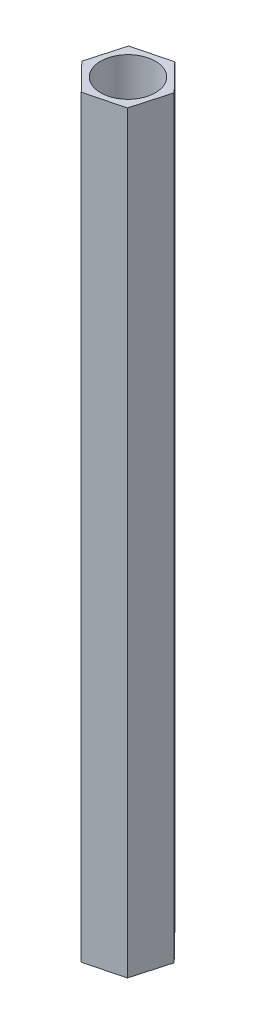
ISO-10303-21;
HEADER;
FILE_DESCRIPTION(('STEP AP214'),'2;1');
FILE_NAME('part.step','',(''),(''),'','','');
FILE_SCHEMA(('AUTOMOTIVE_DESIGN { 1 0 10303 214 1 1 1 1 }'));
ENDSEC;
DATA;
#1=APPLICATION_CONTEXT('core data for automotive mechanical design processes');
#2=APPLICATION_PROTOCOL_DEFINITION('international standard','automotive_design',2000,#1);
#3=PRODUCT_CONTEXT('',#1,'mechanical');
#4=PRODUCT('Part','Part','',(#3));
#5=PRODUCT_RELATED_PRODUCT_CATEGORY('part','',(#4));
#6=PRODUCT_DEFINITION_FORMATION('','',#4);
#7=PRODUCT_DEFINITION_CONTEXT('part definition',#1,'design');
#8=PRODUCT_DEFINITION('design','',#6,#7);
#9=PRODUCT_DEFINITION_SHAPE('','',#8);
#10=(LENGTH_UNIT() NAMED_UNIT(*) SI_UNIT(.MILLI.,.METRE.));
#11=(NAMED_UNIT(*) PLANE_ANGLE_UNIT() SI_UNIT($,.RADIAN.));
#12=(NAMED_UNIT(*) SI_UNIT($,.STERADIAN.) SOLID_ANGLE_UNIT());
#13=UNCERTAINTY_MEASURE_WITH_UNIT(LENGTH_MEASURE(1.E-05),#10,'distance_accuracy_value','');
#14=(GEOMETRIC_REPRESENTATION_CONTEXT(3) GLOBAL_UNCERTAINTY_ASSIGNED_CONTEXT((#13)) GLOBAL_UNIT_ASSIGNED_CONTEXT((#10,
#11,#12)) REPRESENTATION_CONTEXT('',''));
#15=CARTESIAN_POINT('',(0.,0.,0.));
#16=DIRECTION('',(0.,0.,1.));
#17=DIRECTION('',(1.,0.,0.));
#18=AXIS2_PLACEMENT_3D('',#15,#16,#17);
#19=CARTESIAN_POINT('',(-0.466108552747367,34.39,1.66815551345064));
#20=DIRECTION('',(-0.248500740996758,0.,-0.968631705925458));
#21=DIRECTION('',(-0.968631705925458,0.,0.248500740996758));
#22=AXIS2_PLACEMENT_3D('',#19,#20,#21);
#23=PLANE('',#22);
#24=DIRECTION('',(0.968631705925458,0.,-0.248500740996758));
#25=VECTOR('',#24,1.);
#26=CARTESIAN_POINT('',(-0.466108552747367,0.,1.66815551345064));
#27=LINE('',#26,#25);
#28=CARTESIAN_POINT('',(-0.466108552747367,0.,1.66815551345064));
#29=VERTEX_POINT('',#28);
#30=CARTESIAN_POINT('',(1.21161077573764,0.,1.23773960432574));
#31=VERTEX_POINT('',#30);
#32=EDGE_CURVE('E119',#29,#31,#27,.T.);
#33=ORIENTED_EDGE('',*,*,#32,.T.);
#34=DIRECTION('',(0.,-1.,0.));
#35=VECTOR('',#34,1.);
#36=CARTESIAN_POINT('',(1.21161077573764,34.39,1.23773960432574));
#37=LINE('',#36,#35);
#38=CARTESIAN_POINT('',(1.21161077573764,34.39,1.23773960432574));
#39=VERTEX_POINT('',#38);
#40=EDGE_CURVE('E11',#39,#31,#37,.T.);
#41=ORIENTED_EDGE('',*,*,#40,.F.);
#42=DIRECTION('',(0.968631705925458,0.,-0.248500740996758));
#43=VECTOR('',#42,1.);
#44=CARTESIAN_POINT('',(-0.466108552747367,34.39,1.66815551345064));
#45=LINE('',#44,#43);
#46=CARTESIAN_POINT('',(-0.466108552747367,34.39,1.66815551345064));
#47=VERTEX_POINT('',#46);
#48=EDGE_CURVE('E130',#47,#39,#45,.T.);
#49=ORIENTED_EDGE('',*,*,#48,.F.);
#50=DIRECTION('',(0.,-1.,0.));
#51=VECTOR('',#50,1.);
#52=CARTESIAN_POINT('',(-0.466108552747367,34.39,1.66815551345064));
#53=LINE('',#52,#51);
#54=EDGE_CURVE('E115',#47,#29,#53,.T.);
#55=ORIENTED_EDGE('',*,*,#54,.T.);
#56=EDGE_LOOP('',(#33,#41,#49,#55));
#57=FACE_BOUND('',#56,.T.);
#58=ADVANCED_FACE('F35',(#57),#23,.F.);
#59=CARTESIAN_POINT('',(1.21161077573764,34.39,1.23773960432574));
#60=DIRECTION('',(-0.963110034740883,0.,-0.269107898400279));
#61=DIRECTION('',(-0.269107898400279,0.,0.963110034740883));
#62=AXIS2_PLACEMENT_3D('',#59,#60,#61);
#63=PLANE('',#62);
#64=DIRECTION('',(0.269107898400279,0.,-0.963110034740883));
#65=VECTOR('',#64,1.);
#66=CARTESIAN_POINT('',(1.21161077573764,0.,1.23773960432574));
#67=LINE('',#66,#65);
#68=CARTESIAN_POINT('',(1.67771932848501,0.,-0.430415909124899));
#69=VERTEX_POINT('',#68);
#70=EDGE_CURVE('E122',#31,#69,#67,.T.);
#71=ORIENTED_EDGE('',*,*,#70,.T.);
#72=DIRECTION('',(0.,-1.,0.));
#73=VECTOR('',#72,1.);
#74=CARTESIAN_POINT('',(1.67771932848501,34.39,-0.430415909124899));
#75=LINE('',#74,#73);
#76=CARTESIAN_POINT('',(1.67771932848501,34.39,-0.430415909124899));
#77=VERTEX_POINT('',#76);
#78=EDGE_CURVE('E43',#77,#69,#75,.T.);
#79=ORIENTED_EDGE('',*,*,#78,.F.);
#80=DIRECTION('',(0.269107898400279,0.,-0.963110034740883));
#81=VECTOR('',#80,1.);
#82=CARTESIAN_POINT('',(1.21161077573764,34.39,1.23773960432574));
#83=LINE('',#82,#81);
#84=EDGE_CURVE('E88',#39,#77,#83,.T.);
#85=ORIENTED_EDGE('',*,*,#84,.F.);
#86=ORIENTED_EDGE('',*,*,#40,.T.);
#87=EDGE_LOOP('',(#71,#79,#85,#86));
#88=FACE_BOUND('',#87,.T.);
#89=ADVANCED_FACE('F155',(#88),#63,.F.);
#90=CARTESIAN_POINT('',(1.67771932848501,34.39,-0.430415909124899));
#91=DIRECTION('',(-0.714609293744125,0.,0.699523807525178));
#92=DIRECTION('',(0.699523807525178,0.,0.714609293744125));
#93=AXIS2_PLACEMENT_3D('',#90,#91,#92);
#94=PLANE('',#93);
#95=DIRECTION('',(-0.699523807525178,0.,-0.714609293744125));
#96=VECTOR('',#95,1.);
#97=CARTESIAN_POINT('',(1.67771932848501,0.,-0.430415909124899));
#98=LINE('',#97,#96);
#99=CARTESIAN_POINT('',(0.466108552747367,0.,-1.66815551345064));
#100=VERTEX_POINT('',#99);
#101=EDGE_CURVE('E125',#69,#100,#98,.T.);
#102=ORIENTED_EDGE('',*,*,#101,.T.);
#103=DIRECTION('',(0.,-1.,0.));
#104=VECTOR('',#103,1.);
#105=CARTESIAN_POINT('',(0.466108552747367,34.39,-1.66815551345064));
#106=LINE('',#105,#104);
#107=CARTESIAN_POINT('',(0.466108552747367,34.39,-1.66815551345064));
#108=VERTEX_POINT('',#107);
#109=EDGE_CURVE('E110',#108,#100,#106,.T.);
#110=ORIENTED_EDGE('',*,*,#109,.F.);
#111=DIRECTION('',(-0.699523807525178,0.,-0.714609293744125));
#112=VECTOR('',#111,1.);
#113=CARTESIAN_POINT('',(1.67771932848501,34.39,-0.430415909124899));
#114=LINE('',#113,#112);
#115=EDGE_CURVE('E101',#77,#108,#114,.T.);
#116=ORIENTED_EDGE('',*,*,#115,.F.);
#117=ORIENTED_EDGE('',*,*,#78,.T.);
#118=EDGE_LOOP('',(#102,#110,#116,#117));
#119=FACE_BOUND('',#118,.T.);
#120=ADVANCED_FACE('F136',(#119),#94,.F.);
#121=CARTESIAN_POINT('',(0.466108552747367,34.39,-1.66815551345064));
#122=DIRECTION('',(0.248500740996758,0.,0.968631705925458));
#123=DIRECTION('',(0.968631705925458,0.,-0.248500740996758));
#124=AXIS2_PLACEMENT_3D('',#121,#122,#123);
#125=PLANE('',#124);
#126=DIRECTION('',(-0.968631705925458,0.,0.248500740996758));
#127=VECTOR('',#126,1.);
#128=CARTESIAN_POINT('',(0.466108552747367,0.,-1.66815551345064));
#129=LINE('',#128,#127);
#130=CARTESIAN_POINT('',(-1.21161077573764,0.,-1.23773960432574));
#131=VERTEX_POINT('',#130);
#132=EDGE_CURVE('E109',#100,#131,#129,.T.);
#133=ORIENTED_EDGE('',*,*,#132,.T.);
#134=DIRECTION('',(0.,-1.,0.));
#135=VECTOR('',#134,1.);
#136=CARTESIAN_POINT('',(-1.21161077573764,34.39,-1.23773960432574));
#137=LINE('',#136,#135);
#138=CARTESIAN_POINT('',(-1.21161077573764,34.39,-1.23773960432574));
#139=VERTEX_POINT('',#138);
#140=EDGE_CURVE('E106',#139,#131,#137,.T.);
#141=ORIENTED_EDGE('',*,*,#140,.F.);
#142=DIRECTION('',(-0.968631705925458,0.,0.248500740996758));
#143=VECTOR('',#142,1.);
#144=CARTESIAN_POINT('',(0.466108552747367,34.39,-1.66815551345064));
#145=LINE('',#144,#143);
#146=EDGE_CURVE('E95',#108,#139,#145,.T.);
#147=ORIENTED_EDGE('',*,*,#146,.F.);
#148=ORIENTED_EDGE('',*,*,#109,.T.);
#149=EDGE_LOOP('',(#133,#141,#147,#148));
#150=FACE_BOUND('',#149,.T.);
#151=ADVANCED_FACE('F107',(#150),#125,.F.);
#152=CARTESIAN_POINT('',(-1.21161077573764,34.39,-1.23773960432574));
#153=DIRECTION('',(0.963110034740883,0.,0.269107898400279));
#154=DIRECTION('',(0.269107898400279,0.,-0.963110034740883));
#155=AXIS2_PLACEMENT_3D('',#152,#153,#154);
#156=PLANE('',#155);
#157=DIRECTION('',(-0.269107898400279,0.,0.963110034740883));
#158=VECTOR('',#157,1.);
#159=CARTESIAN_POINT('',(-1.21161077573764,0.,-1.23773960432574));
#160=LINE('',#159,#158);
#161=CARTESIAN_POINT('',(-1.67771932848501,0.,0.430415909124899));
#162=VERTEX_POINT('',#161);
#163=EDGE_CURVE('E74',#131,#162,#160,.T.);
#164=ORIENTED_EDGE('',*,*,#163,.T.);
#165=DIRECTION('',(0.,-1.,0.));
#166=VECTOR('',#165,1.);
#167=CARTESIAN_POINT('',(-1.67771932848501,34.39,0.430415909124899));
#168=LINE('',#167,#166);
#169=CARTESIAN_POINT('',(-1.67771932848501,34.39,0.430415909124899));
#170=VERTEX_POINT('',#169);
#171=EDGE_CURVE('E111',#170,#162,#168,.T.);
#172=ORIENTED_EDGE('',*,*,#171,.F.);
#173=DIRECTION('',(-0.269107898400279,0.,0.963110034740883));
#174=VECTOR('',#173,1.);
#175=CARTESIAN_POINT('',(-1.21161077573764,34.39,-1.23773960432574));
#176=LINE('',#175,#174);
#177=EDGE_CURVE('E99',#139,#170,#176,.T.);
#178=ORIENTED_EDGE('',*,*,#177,.F.);
#179=ORIENTED_EDGE('',*,*,#140,.T.);
#180=EDGE_LOOP('',(#164,#172,#178,#179));
#181=FACE_BOUND('',#180,.T.);
#182=ADVANCED_FACE('F113',(#181),#156,.F.);
#183=CARTESIAN_POINT('',(-1.67771932848501,34.39,0.430415909124899));
#184=DIRECTION('',(0.714609293744125,0.,-0.699523807525178));
#185=DIRECTION('',(-0.699523807525178,0.,-0.714609293744125));
#186=AXIS2_PLACEMENT_3D('',#183,#184,#185);
#187=PLANE('',#186);
#188=DIRECTION('',(0.699523807525178,0.,0.714609293744125));
#189=VECTOR('',#188,1.);
#190=CARTESIAN_POINT('',(-1.67771932848501,0.,0.430415909124899));
#191=LINE('',#190,#189);
#192=EDGE_CURVE('E80',#162,#29,#191,.T.);
#193=ORIENTED_EDGE('',*,*,#192,.T.);
#194=ORIENTED_EDGE('',*,*,#54,.F.);
#195=DIRECTION('',(0.699523807525178,0.,0.714609293744125));
#196=VECTOR('',#195,1.);
#197=CARTESIAN_POINT('',(-1.67771932848501,34.39,0.430415909124899));
#198=LINE('',#197,#196);
#199=EDGE_CURVE('E51',#170,#47,#198,.T.);
#200=ORIENTED_EDGE('',*,*,#199,.F.);
#201=ORIENTED_EDGE('',*,*,#171,.T.);
#202=EDGE_LOOP('',(#193,#194,#200,#201));
#203=FACE_BOUND('',#202,.T.);
#204=ADVANCED_FACE('F143',(#203),#187,.F.);
#205=CARTESIAN_POINT('',(0.,34.39,0.));
#206=DIRECTION('',(0.,1.,0.));
#207=DIRECTION('',(0.,0.,1.));
#208=AXIS2_PLACEMENT_3D('',#205,#206,#207);
#209=PLANE('',#208);
#210=CARTESIAN_POINT('',(0.,34.39,0.));
#211=DIRECTION('',(0.,1.,0.));
#212=DIRECTION('',(0.,0.,1.));
#213=AXIS2_PLACEMENT_3D('',#210,#211,#212);
#214=CIRCLE('',#213,1.25);
#215=CARTESIAN_POINT('',(0.,34.39,1.25));
#216=VERTEX_POINT('',#215);
#217=EDGE_CURVE('E210',#216,#216,#214,.T.);
#218=ORIENTED_EDGE('',*,*,#217,.F.);
#219=EDGE_LOOP('',(#218));
#220=FACE_BOUND('',#219,.T.);
#221=ORIENTED_EDGE('',*,*,#48,.T.);
#222=ORIENTED_EDGE('',*,*,#84,.T.);
#223=ORIENTED_EDGE('',*,*,#115,.T.);
#224=ORIENTED_EDGE('',*,*,#146,.T.);
#225=ORIENTED_EDGE('',*,*,#177,.T.);
#226=ORIENTED_EDGE('',*,*,#199,.T.);
#227=EDGE_LOOP('',(#221,#222,#223,#224,#225,#226));
#228=FACE_BOUND('',#227,.T.);
#229=ADVANCED_FACE('F97',(#220,#228),#209,.T.);
#230=CARTESIAN_POINT('',(0.,0.,0.));
#231=DIRECTION('',(0.,1.,0.));
#232=DIRECTION('',(0.,0.,1.));
#233=AXIS2_PLACEMENT_3D('',#230,#231,#232);
#234=PLANE('',#233);
#235=CARTESIAN_POINT('',(0.,0.,0.));
#236=DIRECTION('',(0.,1.,0.));
#237=DIRECTION('',(0.,0.,1.));
#238=AXIS2_PLACEMENT_3D('',#235,#236,#237);
#239=CIRCLE('',#238,1.25);
#240=CARTESIAN_POINT('',(0.,0.,1.25));
#241=VERTEX_POINT('',#240);
#242=EDGE_CURVE('E123',#241,#241,#239,.T.);
#243=ORIENTED_EDGE('',*,*,#242,.T.);
#244=EDGE_LOOP('',(#243));
#245=FACE_BOUND('',#244,.T.);
#246=ORIENTED_EDGE('',*,*,#32,.F.);
#247=ORIENTED_EDGE('',*,*,#192,.F.);
#248=ORIENTED_EDGE('',*,*,#163,.F.);
#249=ORIENTED_EDGE('',*,*,#132,.F.);
#250=ORIENTED_EDGE('',*,*,#101,.F.);
#251=ORIENTED_EDGE('',*,*,#70,.F.);
#252=EDGE_LOOP('',(#246,#247,#248,#249,#250,#251));
#253=FACE_BOUND('',#252,.T.);
#254=ADVANCED_FACE('F139',(#245,#253),#234,.F.);
#255=CARTESIAN_POINT('',(0.,0.,0.));
#256=DIRECTION('',(0.,1.,0.));
#257=DIRECTION('',(0.,0.,1.));
#258=AXIS2_PLACEMENT_3D('',#255,#256,#257);
#259=CYLINDRICAL_SURFACE('',#258,1.25);
#260=ORIENTED_EDGE('',*,*,#242,.F.);
#261=EDGE_LOOP('',(#260));
#262=FACE_BOUND('',#261,.T.);
#263=ORIENTED_EDGE('',*,*,#217,.T.);
#264=EDGE_LOOP('',(#263));
#265=FACE_BOUND('',#264,.T.);
#266=ADVANCED_FACE('F192',(#262,#265),#259,.F.);
#267=CLOSED_SHELL('',(#58,#89,#120,#151,#182,#204,#229,#254,#266));
#268=MANIFOLD_SOLID_BREP('B2',#267);
#269=ADVANCED_BREP_SHAPE_REPRESENTATION('',(#18,#268),#14);
#270=SHAPE_DEFINITION_REPRESENTATION(#9,#269);
ENDSEC;
END-ISO-10303-21;
